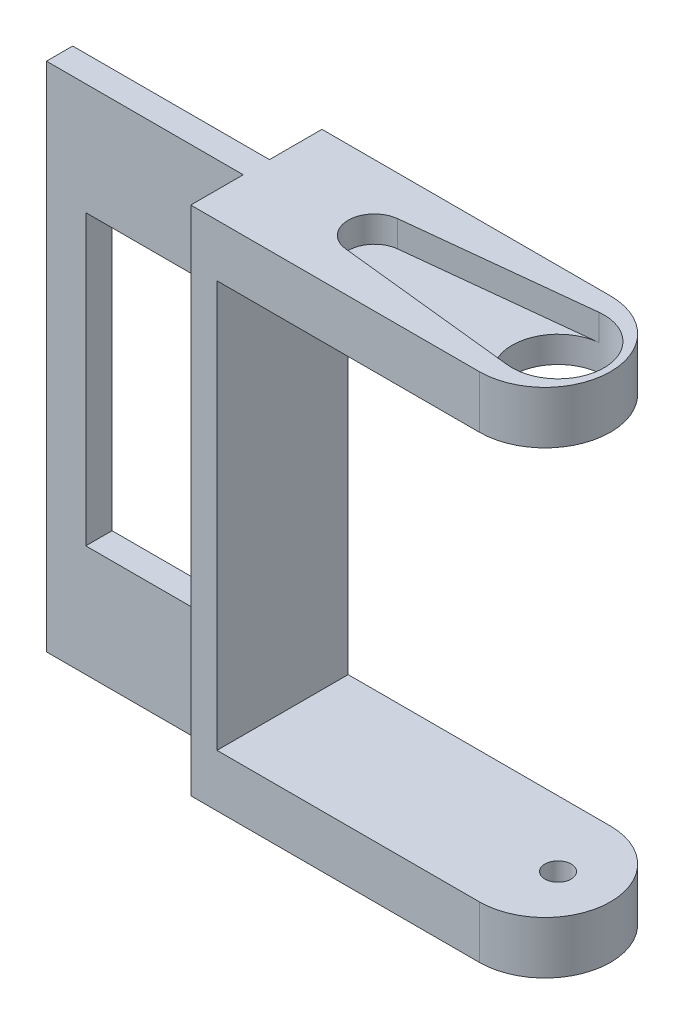
ISO-10303-21;
HEADER;
FILE_DESCRIPTION(('STEP AP214'),'2;1');
FILE_NAME('part.step','',(''),(''),'','','');
FILE_SCHEMA(('AUTOMOTIVE_DESIGN { 1 0 10303 214 1 1 1 1 }'));
ENDSEC;
DATA;
#1=APPLICATION_CONTEXT('core data for automotive mechanical design processes');
#2=APPLICATION_PROTOCOL_DEFINITION('international standard','automotive_design',2000,#1);
#3=PRODUCT_CONTEXT('',#1,'mechanical');
#4=PRODUCT('Part','Part','',(#3));
#5=PRODUCT_RELATED_PRODUCT_CATEGORY('part','',(#4));
#6=PRODUCT_DEFINITION_FORMATION('','',#4);
#7=PRODUCT_DEFINITION_CONTEXT('part definition',#1,'design');
#8=PRODUCT_DEFINITION('design','',#6,#7);
#9=PRODUCT_DEFINITION_SHAPE('','',#8);
#10=(LENGTH_UNIT() NAMED_UNIT(*) SI_UNIT(.MILLI.,.METRE.));
#11=(NAMED_UNIT(*) PLANE_ANGLE_UNIT() SI_UNIT($,.RADIAN.));
#12=(NAMED_UNIT(*) SI_UNIT($,.STERADIAN.) SOLID_ANGLE_UNIT());
#13=UNCERTAINTY_MEASURE_WITH_UNIT(LENGTH_MEASURE(1.E-05),#10,'distance_accuracy_value','');
#14=(GEOMETRIC_REPRESENTATION_CONTEXT(3) GLOBAL_UNCERTAINTY_ASSIGNED_CONTEXT((#13)) GLOBAL_UNIT_ASSIGNED_CONTEXT((#10,
#11,#12)) REPRESENTATION_CONTEXT('',''));
#15=CARTESIAN_POINT('',(0.,0.,0.));
#16=DIRECTION('',(0.,0.,1.));
#17=DIRECTION('',(1.,0.,0.));
#18=AXIS2_PLACEMENT_3D('',#15,#16,#17);
#19=CARTESIAN_POINT('',(-5.,-21.6563307313725,5.));
#20=DIRECTION('',(0.,1.,0.));
#21=DIRECTION('',(-1.,0.,0.));
#22=AXIS2_PLACEMENT_3D('',#19,#20,#21);
#23=CYLINDRICAL_SURFACE('',#22,5.);
#24=DIRECTION('',(0.,1.,0.));
#25=VECTOR('',#24,1.);
#26=CARTESIAN_POINT('',(-5.,0.,10.));
#27=LINE('',#26,#25);
#28=CARTESIAN_POINT('',(-5.,-21.6563307313725,10.));
#29=VERTEX_POINT('',#28);
#30=CARTESIAN_POINT('',(-5.,-17.6563307313725,10.));
#31=VERTEX_POINT('',#30);
#32=EDGE_CURVE('E262',#29,#31,#27,.T.);
#33=ORIENTED_EDGE('',*,*,#32,.F.);
#34=CARTESIAN_POINT('',(-5.,-21.6563307313725,5.));
#35=DIRECTION('',(0.,1.,0.));
#36=DIRECTION('',(-1.,0.,0.));
#37=AXIS2_PLACEMENT_3D('',#34,#35,#36);
#38=CIRCLE('',#37,5.);
#39=CARTESIAN_POINT('',(-5.,-21.6563307313725,0.));
#40=VERTEX_POINT('',#39);
#41=EDGE_CURVE('E49',#40,#29,#38,.F.);
#42=ORIENTED_EDGE('',*,*,#41,.F.);
#43=DIRECTION('',(0.,-1.,0.));
#44=VECTOR('',#43,1.);
#45=CARTESIAN_POINT('',(-5.,-21.6563307313725,0.));
#46=LINE('',#45,#44);
#47=CARTESIAN_POINT('',(-5.,-17.6563307313725,0.));
#48=VERTEX_POINT('',#47);
#49=EDGE_CURVE('E265',#48,#40,#46,.T.);
#50=ORIENTED_EDGE('',*,*,#49,.F.);
#51=CARTESIAN_POINT('',(-5.,-17.6563307313725,5.));
#52=DIRECTION('',(0.,-1.,0.));
#53=DIRECTION('',(0.,0.,-1.));
#54=AXIS2_PLACEMENT_3D('',#51,#52,#53);
#55=CIRCLE('',#54,5.);
#56=EDGE_CURVE('E11',#31,#48,#55,.F.);
#57=ORIENTED_EDGE('',*,*,#56,.F.);
#58=EDGE_LOOP('',(#33,#42,#50,#57));
#59=FACE_BOUND('',#58,.T.);
#60=ADVANCED_FACE('F41',(#59),#23,.T.);
#61=CARTESIAN_POINT('',(-5.,13.3436692686275,5.));
#62=DIRECTION('',(0.,1.,0.));
#63=DIRECTION('',(-1.,0.,0.));
#64=AXIS2_PLACEMENT_3D('',#61,#62,#63);
#65=CYLINDRICAL_SURFACE('',#64,5.);
#66=DIRECTION('',(0.,1.,0.));
#67=VECTOR('',#66,1.);
#68=CARTESIAN_POINT('',(-5.,0.,10.));
#69=LINE('',#68,#67);
#70=CARTESIAN_POINT('',(-5.,13.3436692686275,10.));
#71=VERTEX_POINT('',#70);
#72=CARTESIAN_POINT('',(-5.,17.3436692686275,10.));
#73=VERTEX_POINT('',#72);
#74=EDGE_CURVE('E252',#71,#73,#69,.T.);
#75=ORIENTED_EDGE('',*,*,#74,.F.);
#76=CARTESIAN_POINT('',(-5.,13.3436692686275,5.));
#77=DIRECTION('',(0.,1.,0.));
#78=DIRECTION('',(-1.,0.,0.));
#79=AXIS2_PLACEMENT_3D('',#76,#77,#78);
#80=CIRCLE('',#79,5.);
#81=CARTESIAN_POINT('',(-5.,13.3436692686275,0.));
#82=VERTEX_POINT('',#81);
#83=EDGE_CURVE('E258',#82,#71,#80,.F.);
#84=ORIENTED_EDGE('',*,*,#83,.F.);
#85=DIRECTION('',(0.,-1.,0.));
#86=VECTOR('',#85,1.);
#87=CARTESIAN_POINT('',(-5.,13.3436692686275,0.));
#88=LINE('',#87,#86);
#89=CARTESIAN_POINT('',(-5.,17.3436692686275,0.));
#90=VERTEX_POINT('',#89);
#91=EDGE_CURVE('E255',#90,#82,#88,.T.);
#92=ORIENTED_EDGE('',*,*,#91,.F.);
#93=CARTESIAN_POINT('',(-5.,17.3436692686275,5.));
#94=DIRECTION('',(0.,-1.,0.));
#95=DIRECTION('',(0.,0.,-1.));
#96=AXIS2_PLACEMENT_3D('',#93,#94,#95);
#97=CIRCLE('',#96,5.);
#98=EDGE_CURVE('E260',#73,#90,#97,.F.);
#99=ORIENTED_EDGE('',*,*,#98,.F.);
#100=EDGE_LOOP('',(#75,#84,#92,#99));
#101=FACE_BOUND('',#100,.T.);
#102=ADVANCED_FACE('F381',(#101),#65,.T.);
#103=CARTESIAN_POINT('',(-27.,-21.6563307313725,10.));
#104=DIRECTION('',(1.,0.,0.));
#105=DIRECTION('',(0.,1.,0.));
#106=AXIS2_PLACEMENT_3D('',#103,#104,#105);
#107=PLANE('',#106);
#108=DIRECTION('',(0.,0.,1.));
#109=VECTOR('',#108,1.);
#110=CARTESIAN_POINT('',(-27.,8.8436692686275,0.999999999999997));
#111=LINE('',#110,#109);
#112=CARTESIAN_POINT('',(-27.,8.8436692686275,4.));
#113=VERTEX_POINT('',#112);
#114=CARTESIAN_POINT('',(-27.,8.8436692686275,6.));
#115=VERTEX_POINT('',#114);
#116=EDGE_CURVE('E186',#113,#115,#111,.T.);
#117=ORIENTED_EDGE('',*,*,#116,.F.);
#118=DIRECTION('',(0.,1.,0.));
#119=VECTOR('',#118,1.);
#120=CARTESIAN_POINT('',(-27.,-21.6563307313725,4.));
#121=LINE('',#120,#119);
#122=CARTESIAN_POINT('',(-27.,17.3436692686275,4.));
#123=VERTEX_POINT('',#122);
#124=EDGE_CURVE('E199',#113,#123,#121,.T.);
#125=ORIENTED_EDGE('',*,*,#124,.T.);
#126=DIRECTION('',(0.,0.,-1.));
#127=VECTOR('',#126,1.);
#128=CARTESIAN_POINT('',(-27.,17.3436692686275,10.));
#129=LINE('',#128,#127);
#130=CARTESIAN_POINT('',(-27.,17.3436692686275,0.));
#131=VERTEX_POINT('',#130);
#132=EDGE_CURVE('E225',#123,#131,#129,.T.);
#133=ORIENTED_EDGE('',*,*,#132,.T.);
#134=DIRECTION('',(0.,-1.,0.));
#135=VECTOR('',#134,1.);
#136=CARTESIAN_POINT('',(-27.,-21.6563307313725,0.));
#137=LINE('',#136,#135);
#138=CARTESIAN_POINT('',(-27.,-21.6563307313725,0.));
#139=VERTEX_POINT('',#138);
#140=EDGE_CURVE('E226',#131,#139,#137,.T.);
#141=ORIENTED_EDGE('',*,*,#140,.T.);
#142=DIRECTION('',(0.,0.,-1.));
#143=VECTOR('',#142,1.);
#144=CARTESIAN_POINT('',(-27.,-21.6563307313725,10.));
#145=LINE('',#144,#143);
#146=CARTESIAN_POINT('',(-27.,-21.6563307313725,4.));
#147=VERTEX_POINT('',#146);
#148=EDGE_CURVE('E249',#147,#139,#145,.T.);
#149=ORIENTED_EDGE('',*,*,#148,.F.);
#150=CARTESIAN_POINT('',(-27.,-13.1563307313725,4.));
#151=VERTEX_POINT('',#150);
#152=EDGE_CURVE('E185',#147,#151,#121,.T.);
#153=ORIENTED_EDGE('',*,*,#152,.T.);
#154=DIRECTION('',(0.,0.,1.));
#155=VECTOR('',#154,1.);
#156=CARTESIAN_POINT('',(-27.,-13.1563307313725,0.999999999999997));
#157=LINE('',#156,#155);
#158=CARTESIAN_POINT('',(-27.,-13.1563307313725,6.));
#159=VERTEX_POINT('',#158);
#160=EDGE_CURVE('E56',#151,#159,#157,.T.);
#161=ORIENTED_EDGE('',*,*,#160,.T.);
#162=DIRECTION('',(0.,1.,0.));
#163=VECTOR('',#162,1.);
#164=CARTESIAN_POINT('',(-27.,-21.6563307313725,6.));
#165=LINE('',#164,#163);
#166=CARTESIAN_POINT('',(-27.,-21.6563307313725,6.));
#167=VERTEX_POINT('',#166);
#168=EDGE_CURVE('E182',#167,#159,#165,.T.);
#169=ORIENTED_EDGE('',*,*,#168,.F.);
#170=CARTESIAN_POINT('',(-27.,-21.6563307313725,10.));
#171=VERTEX_POINT('',#170);
#172=EDGE_CURVE('E250',#171,#167,#145,.T.);
#173=ORIENTED_EDGE('',*,*,#172,.F.);
#174=DIRECTION('',(0.,-1.,0.));
#175=VECTOR('',#174,1.);
#176=CARTESIAN_POINT('',(-27.,-21.6563307313725,10.));
#177=LINE('',#176,#175);
#178=CARTESIAN_POINT('',(-27.,17.3436692686275,10.));
#179=VERTEX_POINT('',#178);
#180=EDGE_CURVE('E209',#179,#171,#177,.T.);
#181=ORIENTED_EDGE('',*,*,#180,.F.);
#182=CARTESIAN_POINT('',(-27.,17.3436692686275,6.));
#183=VERTEX_POINT('',#182);
#184=EDGE_CURVE('E240',#179,#183,#129,.T.);
#185=ORIENTED_EDGE('',*,*,#184,.T.);
#186=EDGE_CURVE('E200',#115,#183,#165,.T.);
#187=ORIENTED_EDGE('',*,*,#186,.F.);
#188=EDGE_LOOP('',(#117,#125,#133,#141,#149,#153,#161,#169,#173,#181,#185,#187));
#189=FACE_BOUND('',#188,.T.);
#190=ADVANCED_FACE('F179',(#189),#107,.F.);
#191=CARTESIAN_POINT('',(0.,-21.6563307313725,10.));
#192=DIRECTION('',(0.,1.,0.));
#193=DIRECTION('',(-1.,0.,0.));
#194=AXIS2_PLACEMENT_3D('',#191,#192,#193);
#195=PLANE('',#194);
#196=CARTESIAN_POINT('',(-4.,-21.6563307313725,5.));
#197=DIRECTION('',(0.,1.,0.));
#198=DIRECTION('',(-1.,0.,0.));
#199=AXIS2_PLACEMENT_3D('',#196,#197,#198);
#200=CIRCLE('',#199,1.);
#201=CARTESIAN_POINT('',(-5.,-21.6563307313725,5.));
#202=VERTEX_POINT('',#201);
#203=EDGE_CURVE('E299',#202,#202,#200,.T.);
#204=ORIENTED_EDGE('',*,*,#203,.T.);
#205=EDGE_LOOP('',(#204));
#206=FACE_BOUND('',#205,.T.);
#207=DIRECTION('',(1.,0.,0.));
#208=VECTOR('',#207,1.);
#209=CARTESIAN_POINT('',(0.,-21.6563307313725,0.));
#210=LINE('',#209,#208);
#211=EDGE_CURVE('E229',#139,#40,#210,.T.);
#212=ORIENTED_EDGE('',*,*,#211,.T.);
#213=ORIENTED_EDGE('',*,*,#41,.T.);
#214=DIRECTION('',(1.,0.,0.));
#215=VECTOR('',#214,1.);
#216=CARTESIAN_POINT('',(0.,-21.6563307313725,10.));
#217=LINE('',#216,#215);
#218=EDGE_CURVE('E212',#171,#29,#217,.T.);
#219=ORIENTED_EDGE('',*,*,#218,.F.);
#220=ORIENTED_EDGE('',*,*,#172,.T.);
#221=DIRECTION('',(1.,0.,0.));
#222=VECTOR('',#221,1.);
#223=CARTESIAN_POINT('',(-27.,-21.6563307313725,6.));
#224=LINE('',#223,#222);
#225=CARTESIAN_POINT('',(-42.,-21.6563307313725,6.));
#226=VERTEX_POINT('',#225);
#227=EDGE_CURVE('E198',#226,#167,#224,.T.);
#228=ORIENTED_EDGE('',*,*,#227,.F.);
#229=DIRECTION('',(0.,0.,1.));
#230=VECTOR('',#229,1.);
#231=CARTESIAN_POINT('',(-42.,-21.6563307313725,4.));
#232=LINE('',#231,#230);
#233=CARTESIAN_POINT('',(-42.,-21.6563307313725,4.));
#234=VERTEX_POINT('',#233);
#235=EDGE_CURVE('E282',#234,#226,#232,.T.);
#236=ORIENTED_EDGE('',*,*,#235,.F.);
#237=DIRECTION('',(-1.,0.,0.));
#238=VECTOR('',#237,1.);
#239=CARTESIAN_POINT('',(-27.,-21.6563307313725,4.));
#240=LINE('',#239,#238);
#241=EDGE_CURVE('E289',#147,#234,#240,.T.);
#242=ORIENTED_EDGE('',*,*,#241,.F.);
#243=ORIENTED_EDGE('',*,*,#148,.T.);
#244=EDGE_LOOP('',(#212,#213,#219,#220,#228,#236,#242,#243));
#245=FACE_BOUND('',#244,.T.);
#246=ADVANCED_FACE('F269',(#206,#245),#195,.F.);
#247=CARTESIAN_POINT('',(-25.,-17.6563307313725,10.));
#248=DIRECTION('',(0.,-1.,0.));
#249=DIRECTION('',(0.,0.,-1.));
#250=AXIS2_PLACEMENT_3D('',#247,#248,#249);
#251=PLANE('',#250);
#252=CARTESIAN_POINT('',(-4.,-17.6563307313725,5.));
#253=DIRECTION('',(0.,-1.,0.));
#254=DIRECTION('',(0.,0.,-1.));
#255=AXIS2_PLACEMENT_3D('',#252,#253,#254);
#256=CIRCLE('',#255,1.);
#257=CARTESIAN_POINT('',(-4.,-17.6563307313725,4.));
#258=VERTEX_POINT('',#257);
#259=EDGE_CURVE('E350',#258,#258,#256,.T.);
#260=ORIENTED_EDGE('',*,*,#259,.T.);
#261=EDGE_LOOP('',(#260));
#262=FACE_BOUND('',#261,.T.);
#263=DIRECTION('',(-1.,0.,0.));
#264=VECTOR('',#263,1.);
#265=CARTESIAN_POINT('',(-25.,-17.6563307313725,10.));
#266=LINE('',#265,#264);
#267=CARTESIAN_POINT('',(-25.,-17.6563307313725,10.));
#268=VERTEX_POINT('',#267);
#269=EDGE_CURVE('E216',#31,#268,#266,.T.);
#270=ORIENTED_EDGE('',*,*,#269,.F.);
#271=ORIENTED_EDGE('',*,*,#56,.T.);
#272=DIRECTION('',(-1.,0.,0.));
#273=VECTOR('',#272,1.);
#274=CARTESIAN_POINT('',(-25.,-17.6563307313725,0.));
#275=LINE('',#274,#273);
#276=CARTESIAN_POINT('',(-25.,-17.6563307313725,0.));
#277=VERTEX_POINT('',#276);
#278=EDGE_CURVE('E232',#48,#277,#275,.T.);
#279=ORIENTED_EDGE('',*,*,#278,.T.);
#280=DIRECTION('',(0.,0.,-1.));
#281=VECTOR('',#280,1.);
#282=CARTESIAN_POINT('',(-25.,-17.6563307313725,10.));
#283=LINE('',#282,#281);
#284=EDGE_CURVE('E246',#268,#277,#283,.T.);
#285=ORIENTED_EDGE('',*,*,#284,.F.);
#286=EDGE_LOOP('',(#270,#271,#279,#285));
#287=FACE_BOUND('',#286,.T.);
#288=ADVANCED_FACE('F398',(#262,#287),#251,.F.);
#289=CARTESIAN_POINT('',(-25.,13.3436692686275,10.));
#290=DIRECTION('',(-1.,0.,0.));
#291=DIRECTION('',(0.,-1.,0.));
#292=AXIS2_PLACEMENT_3D('',#289,#290,#291);
#293=PLANE('',#292);
#294=DIRECTION('',(0.,1.,0.));
#295=VECTOR('',#294,1.);
#296=CARTESIAN_POINT('',(-25.,13.3436692686275,0.));
#297=LINE('',#296,#295);
#298=CARTESIAN_POINT('',(-25.,13.3436692686275,0.));
#299=VERTEX_POINT('',#298);
#300=EDGE_CURVE('E234',#277,#299,#297,.T.);
#301=ORIENTED_EDGE('',*,*,#300,.T.);
#302=DIRECTION('',(0.,0.,-1.));
#303=VECTOR('',#302,1.);
#304=CARTESIAN_POINT('',(-25.,13.3436692686275,10.));
#305=LINE('',#304,#303);
#306=CARTESIAN_POINT('',(-25.,13.3436692686275,10.));
#307=VERTEX_POINT('',#306);
#308=EDGE_CURVE('E243',#307,#299,#305,.T.);
#309=ORIENTED_EDGE('',*,*,#308,.F.);
#310=DIRECTION('',(0.,1.,0.));
#311=VECTOR('',#310,1.);
#312=CARTESIAN_POINT('',(-25.,13.3436692686275,10.));
#313=LINE('',#312,#311);
#314=EDGE_CURVE('E218',#268,#307,#313,.T.);
#315=ORIENTED_EDGE('',*,*,#314,.F.);
#316=ORIENTED_EDGE('',*,*,#284,.T.);
#317=EDGE_LOOP('',(#301,#309,#315,#316));
#318=FACE_BOUND('',#317,.T.);
#319=ADVANCED_FACE('F400',(#318),#293,.F.);
#320=CARTESIAN_POINT('',(0.,13.3436692686275,10.));
#321=DIRECTION('',(0.,1.,0.));
#322=DIRECTION('',(-1.,0.,0.));
#323=AXIS2_PLACEMENT_3D('',#320,#321,#322);
#324=PLANE('',#323);
#325=CARTESIAN_POINT('',(-4.,13.3436692686275,5.));
#326=DIRECTION('',(0.,1.,0.));
#327=DIRECTION('',(-1.,0.,0.));
#328=AXIS2_PLACEMENT_3D('',#325,#326,#327);
#329=CIRCLE('',#328,3.49999999999999);
#330=CARTESIAN_POINT('',(-7.49999999999999,13.3436692686275,5.));
#331=VERTEX_POINT('',#330);
#332=EDGE_CURVE('E324',#331,#331,#329,.T.);
#333=ORIENTED_EDGE('',*,*,#332,.T.);
#334=EDGE_LOOP('',(#333));
#335=FACE_BOUND('',#334,.T.);
#336=DIRECTION('',(1.,0.,0.));
#337=VECTOR('',#336,1.);
#338=CARTESIAN_POINT('',(0.,13.3436692686275,0.));
#339=LINE('',#338,#337);
#340=EDGE_CURVE('E236',#299,#82,#339,.T.);
#341=ORIENTED_EDGE('',*,*,#340,.T.);
#342=ORIENTED_EDGE('',*,*,#83,.T.);
#343=DIRECTION('',(1.,0.,0.));
#344=VECTOR('',#343,1.);
#345=CARTESIAN_POINT('',(0.,13.3436692686275,10.));
#346=LINE('',#345,#344);
#347=EDGE_CURVE('E220',#307,#71,#346,.T.);
#348=ORIENTED_EDGE('',*,*,#347,.F.);
#349=ORIENTED_EDGE('',*,*,#308,.T.);
#350=EDGE_LOOP('',(#341,#342,#348,#349));
#351=FACE_BOUND('',#350,.T.);
#352=ADVANCED_FACE('F404',(#335,#351),#324,.F.);
#353=CARTESIAN_POINT('',(-27.,17.3436692686275,10.));
#354=DIRECTION('',(0.,-1.,0.));
#355=DIRECTION('',(0.,0.,-1.));
#356=AXIS2_PLACEMENT_3D('',#353,#354,#355);
#357=PLANE('',#356);
#358=DIRECTION('',(0.994243636219647,0.,0.107142857142857));
#359=VECTOR('',#358,1.);
#360=CARTESIAN_POINT('',(-18.2142857142857,17.3436692686275,6.98848727243929));
#361=LINE('',#360,#359);
#362=CARTESIAN_POINT('',(-18.2142857142857,17.3436692686275,6.98848727243929));
#363=VERTEX_POINT('',#362);
#364=CARTESIAN_POINT('',(-4.375,17.3436692686275,8.47985272676876));
#365=VERTEX_POINT('',#364);
#366=EDGE_CURVE('E340',#363,#365,#361,.T.);
#367=ORIENTED_EDGE('',*,*,#366,.F.);
#368=CARTESIAN_POINT('',(-18.,17.3436692686275,5.));
#369=DIRECTION('',(0.,1.,0.));
#370=DIRECTION('',(0.,0.,1.));
#371=AXIS2_PLACEMENT_3D('',#368,#369,#370);
#372=CIRCLE('',#371,2.);
#373=CARTESIAN_POINT('',(-18.2142857142857,17.3436692686275,3.0115127275607));
#374=VERTEX_POINT('',#373);
#375=EDGE_CURVE('E327',#374,#363,#372,.T.);
#376=ORIENTED_EDGE('',*,*,#375,.F.);
#377=DIRECTION('',(-0.994243636219647,0.,0.107142857142857));
#378=VECTOR('',#377,1.);
#379=CARTESIAN_POINT('',(-18.2142857142857,17.3436692686275,3.0115127275607));
#380=LINE('',#379,#378);
#381=CARTESIAN_POINT('',(-4.375,17.3436692686275,1.52014727323123));
#382=VERTEX_POINT('',#381);
#383=EDGE_CURVE('E332',#382,#374,#380,.T.);
#384=ORIENTED_EDGE('',*,*,#383,.F.);
#385=CARTESIAN_POINT('',(-4.,17.3436692686275,4.99999999999999));
#386=DIRECTION('',(0.,1.,0.));
#387=DIRECTION('',(0.,0.,-1.));
#388=AXIS2_PLACEMENT_3D('',#385,#386,#387);
#389=CIRCLE('',#388,3.5);
#390=EDGE_CURVE('E343',#365,#382,#389,.T.);
#391=ORIENTED_EDGE('',*,*,#390,.F.);
#392=EDGE_LOOP('',(#367,#376,#384,#391));
#393=FACE_BOUND('',#392,.T.);
#394=DIRECTION('',(-1.,0.,0.));
#395=VECTOR('',#394,1.);
#396=CARTESIAN_POINT('',(-27.,17.3436692686275,10.));
#397=LINE('',#396,#395);
#398=EDGE_CURVE('E223',#73,#179,#397,.T.);
#399=ORIENTED_EDGE('',*,*,#398,.F.);
#400=ORIENTED_EDGE('',*,*,#98,.T.);
#401=DIRECTION('',(-1.,0.,0.));
#402=VECTOR('',#401,1.);
#403=CARTESIAN_POINT('',(-27.,17.3436692686275,0.));
#404=LINE('',#403,#402);
#405=EDGE_CURVE('E213',#90,#131,#404,.T.);
#406=ORIENTED_EDGE('',*,*,#405,.T.);
#407=ORIENTED_EDGE('',*,*,#132,.F.);
#408=DIRECTION('',(-1.,0.,0.));
#409=VECTOR('',#408,1.);
#410=CARTESIAN_POINT('',(-27.,17.3436692686275,4.));
#411=LINE('',#410,#409);
#412=CARTESIAN_POINT('',(-42.,17.3436692686275,4.));
#413=VERTEX_POINT('',#412);
#414=EDGE_CURVE('E295',#123,#413,#411,.T.);
#415=ORIENTED_EDGE('',*,*,#414,.T.);
#416=DIRECTION('',(0.,0.,1.));
#417=VECTOR('',#416,1.);
#418=CARTESIAN_POINT('',(-42.,17.3436692686275,4.));
#419=LINE('',#418,#417);
#420=CARTESIAN_POINT('',(-42.,17.3436692686275,6.));
#421=VERTEX_POINT('',#420);
#422=EDGE_CURVE('E298',#413,#421,#419,.T.);
#423=ORIENTED_EDGE('',*,*,#422,.T.);
#424=DIRECTION('',(1.,0.,0.));
#425=VECTOR('',#424,1.);
#426=CARTESIAN_POINT('',(-27.,17.3436692686275,6.));
#427=LINE('',#426,#425);
#428=EDGE_CURVE('E291',#421,#183,#427,.T.);
#429=ORIENTED_EDGE('',*,*,#428,.T.);
#430=ORIENTED_EDGE('',*,*,#184,.F.);
#431=EDGE_LOOP('',(#399,#400,#406,#407,#415,#423,#429,#430));
#432=FACE_BOUND('',#431,.T.);
#433=ADVANCED_FACE('F303',(#393,#432),#357,.F.);
#434=CARTESIAN_POINT('',(0.,0.,10.));
#435=DIRECTION('',(0.,0.,-1.));
#436=DIRECTION('',(-1.,0.,0.));
#437=AXIS2_PLACEMENT_3D('',#434,#435,#436);
#438=PLANE('',#437);
#439=ORIENTED_EDGE('',*,*,#218,.T.);
#440=ORIENTED_EDGE('',*,*,#32,.T.);
#441=ORIENTED_EDGE('',*,*,#269,.T.);
#442=ORIENTED_EDGE('',*,*,#314,.T.);
#443=ORIENTED_EDGE('',*,*,#347,.T.);
#444=ORIENTED_EDGE('',*,*,#74,.T.);
#445=ORIENTED_EDGE('',*,*,#398,.T.);
#446=ORIENTED_EDGE('',*,*,#180,.T.);
#447=EDGE_LOOP('',(#439,#440,#441,#442,#443,#444,#445,#446));
#448=FACE_BOUND('',#447,.T.);
#449=ADVANCED_FACE('F275',(#448),#438,.F.);
#450=CARTESIAN_POINT('',(0.,0.,0.));
#451=DIRECTION('',(0.,0.,-1.));
#452=DIRECTION('',(-1.,0.,0.));
#453=AXIS2_PLACEMENT_3D('',#450,#451,#452);
#454=PLANE('',#453);
#455=ORIENTED_EDGE('',*,*,#278,.F.);
#456=ORIENTED_EDGE('',*,*,#49,.T.);
#457=ORIENTED_EDGE('',*,*,#211,.F.);
#458=ORIENTED_EDGE('',*,*,#140,.F.);
#459=ORIENTED_EDGE('',*,*,#405,.F.);
#460=ORIENTED_EDGE('',*,*,#91,.T.);
#461=ORIENTED_EDGE('',*,*,#340,.F.);
#462=ORIENTED_EDGE('',*,*,#300,.F.);
#463=EDGE_LOOP('',(#455,#456,#457,#458,#459,#460,#461,#462));
#464=FACE_BOUND('',#463,.T.);
#465=ADVANCED_FACE('F411',(#464),#454,.T.);
#466=CARTESIAN_POINT('',(-27.,-21.6563307313725,4.));
#467=DIRECTION('',(0.,0.,-1.));
#468=DIRECTION('',(-1.,0.,0.));
#469=AXIS2_PLACEMENT_3D('',#466,#467,#468);
#470=PLANE('',#469);
#471=DIRECTION('',(1.,0.,0.));
#472=VECTOR('',#471,1.);
#473=CARTESIAN_POINT('',(-27.,8.8436692686275,4.));
#474=LINE('',#473,#472);
#475=CARTESIAN_POINT('',(-39.,8.8436692686275,4.));
#476=VERTEX_POINT('',#475);
#477=EDGE_CURVE('E318',#476,#113,#474,.T.);
#478=ORIENTED_EDGE('',*,*,#477,.F.);
#479=DIRECTION('',(0.,1.,0.));
#480=VECTOR('',#479,1.);
#481=CARTESIAN_POINT('',(-39.,-21.6563307313725,4.));
#482=LINE('',#481,#480);
#483=CARTESIAN_POINT('',(-39.,-13.1563307313725,4.));
#484=VERTEX_POINT('',#483);
#485=EDGE_CURVE('E320',#484,#476,#482,.T.);
#486=ORIENTED_EDGE('',*,*,#485,.F.);
#487=DIRECTION('',(-1.,0.,0.));
#488=VECTOR('',#487,1.);
#489=CARTESIAN_POINT('',(-27.,-13.1563307313725,4.));
#490=LINE('',#489,#488);
#491=EDGE_CURVE('E315',#151,#484,#490,.T.);
#492=ORIENTED_EDGE('',*,*,#491,.F.);
#493=ORIENTED_EDGE('',*,*,#152,.F.);
#494=ORIENTED_EDGE('',*,*,#241,.T.);
#495=DIRECTION('',(0.,1.,0.));
#496=VECTOR('',#495,1.);
#497=CARTESIAN_POINT('',(-42.,-21.6563307313725,4.));
#498=LINE('',#497,#496);
#499=EDGE_CURVE('E207',#234,#413,#498,.T.);
#500=ORIENTED_EDGE('',*,*,#499,.T.);
#501=ORIENTED_EDGE('',*,*,#414,.F.);
#502=ORIENTED_EDGE('',*,*,#124,.F.);
#503=EDGE_LOOP('',(#478,#486,#492,#493,#494,#500,#501,#502));
#504=FACE_BOUND('',#503,.T.);
#505=ADVANCED_FACE('F414',(#504),#470,.T.);
#506=CARTESIAN_POINT('',(-27.,-21.6563307313725,6.));
#507=DIRECTION('',(0.,0.,1.));
#508=DIRECTION('',(1.,0.,0.));
#509=AXIS2_PLACEMENT_3D('',#506,#507,#508);
#510=PLANE('',#509);
#511=DIRECTION('',(-1.,0.,0.));
#512=VECTOR('',#511,1.);
#513=CARTESIAN_POINT('',(-27.,8.8436692686275,6.));
#514=LINE('',#513,#512);
#515=CARTESIAN_POINT('',(-39.,8.8436692686275,6.));
#516=VERTEX_POINT('',#515);
#517=EDGE_CURVE('E193',#115,#516,#514,.T.);
#518=ORIENTED_EDGE('',*,*,#517,.F.);
#519=ORIENTED_EDGE('',*,*,#186,.T.);
#520=ORIENTED_EDGE('',*,*,#428,.F.);
#521=DIRECTION('',(0.,1.,0.));
#522=VECTOR('',#521,1.);
#523=CARTESIAN_POINT('',(-42.,-21.6563307313725,6.));
#524=LINE('',#523,#522);
#525=EDGE_CURVE('E203',#226,#421,#524,.T.);
#526=ORIENTED_EDGE('',*,*,#525,.F.);
#527=ORIENTED_EDGE('',*,*,#227,.T.);
#528=ORIENTED_EDGE('',*,*,#168,.T.);
#529=DIRECTION('',(1.,0.,0.));
#530=VECTOR('',#529,1.);
#531=CARTESIAN_POINT('',(-27.,-13.1563307313725,6.));
#532=LINE('',#531,#530);
#533=CARTESIAN_POINT('',(-39.,-13.1563307313725,6.));
#534=VERTEX_POINT('',#533);
#535=EDGE_CURVE('E190',#534,#159,#532,.T.);
#536=ORIENTED_EDGE('',*,*,#535,.F.);
#537=DIRECTION('',(0.,-1.,0.));
#538=VECTOR('',#537,1.);
#539=CARTESIAN_POINT('',(-39.,8.8436692686275,6.));
#540=LINE('',#539,#538);
#541=EDGE_CURVE('E64',#516,#534,#540,.T.);
#542=ORIENTED_EDGE('',*,*,#541,.F.);
#543=EDGE_LOOP('',(#518,#519,#520,#526,#527,#528,#536,#542));
#544=FACE_BOUND('',#543,.T.);
#545=ADVANCED_FACE('F196',(#544),#510,.T.);
#546=CARTESIAN_POINT('',(-42.,-21.6563307313725,4.));
#547=DIRECTION('',(-1.,0.,0.));
#548=DIRECTION('',(0.,0.,1.));
#549=AXIS2_PLACEMENT_3D('',#546,#547,#548);
#550=PLANE('',#549);
#551=ORIENTED_EDGE('',*,*,#422,.F.);
#552=ORIENTED_EDGE('',*,*,#499,.F.);
#553=ORIENTED_EDGE('',*,*,#235,.T.);
#554=ORIENTED_EDGE('',*,*,#525,.T.);
#555=EDGE_LOOP('',(#551,#552,#553,#554));
#556=FACE_BOUND('',#555,.T.);
#557=ADVANCED_FACE('F287',(#556),#550,.T.);
#558=CARTESIAN_POINT('',(-4.,-25.6563307313725,5.));
#559=DIRECTION('',(0.,1.,0.));
#560=DIRECTION('',(0.,0.,1.));
#561=AXIS2_PLACEMENT_3D('',#558,#559,#560);
#562=CYLINDRICAL_SURFACE('',#561,1.);
#563=ORIENTED_EDGE('',*,*,#259,.F.);
#564=EDGE_LOOP('',(#563));
#565=FACE_BOUND('',#564,.T.);
#566=ORIENTED_EDGE('',*,*,#203,.F.);
#567=EDGE_LOOP('',(#566));
#568=FACE_BOUND('',#567,.T.);
#569=ADVANCED_FACE('F362',(#565,#568),#562,.F.);
#570=CARTESIAN_POINT('',(-18.,15.3436692686275,5.));
#571=DIRECTION('',(0.,1.,0.));
#572=DIRECTION('',(0.,0.,1.));
#573=AXIS2_PLACEMENT_3D('',#570,#571,#572);
#574=PLANE('',#573);
#575=CARTESIAN_POINT('',(-4.,15.3436692686275,5.));
#576=DIRECTION('',(0.,1.,0.));
#577=DIRECTION('',(0.,0.,1.));
#578=AXIS2_PLACEMENT_3D('',#575,#576,#577);
#579=CIRCLE('',#578,3.49999999999999);
#580=CARTESIAN_POINT('',(-4.375,15.3436692686275,1.52014727323124));
#581=VERTEX_POINT('',#580);
#582=CARTESIAN_POINT('',(-4.375,15.3436692686275,8.47985272676876));
#583=VERTEX_POINT('',#582);
#584=EDGE_CURVE('E322',#581,#583,#579,.T.);
#585=ORIENTED_EDGE('',*,*,#584,.F.);
#586=DIRECTION('',(-0.994243636219647,0.,0.107142857142857));
#587=VECTOR('',#586,1.);
#588=CARTESIAN_POINT('',(-18.2142857142857,15.3436692686275,3.0115127275607));
#589=LINE('',#588,#587);
#590=CARTESIAN_POINT('',(-18.2142857142857,15.3436692686275,3.0115127275607));
#591=VERTEX_POINT('',#590);
#592=EDGE_CURVE('E335',#581,#591,#589,.T.);
#593=ORIENTED_EDGE('',*,*,#592,.T.);
#594=CARTESIAN_POINT('',(-18.,15.3436692686275,5.));
#595=DIRECTION('',(0.,1.,0.));
#596=DIRECTION('',(0.,0.,1.));
#597=AXIS2_PLACEMENT_3D('',#594,#595,#596);
#598=CIRCLE('',#597,2.);
#599=CARTESIAN_POINT('',(-18.2142857142857,15.3436692686275,6.98848727243929));
#600=VERTEX_POINT('',#599);
#601=EDGE_CURVE('E328',#591,#600,#598,.T.);
#602=ORIENTED_EDGE('',*,*,#601,.T.);
#603=DIRECTION('',(0.994243636219647,0.,0.107142857142857));
#604=VECTOR('',#603,1.);
#605=CARTESIAN_POINT('',(-18.2142857142857,15.3436692686275,6.98848727243929));
#606=LINE('',#605,#604);
#607=EDGE_CURVE('E331',#600,#583,#606,.T.);
#608=ORIENTED_EDGE('',*,*,#607,.T.);
#609=EDGE_LOOP('',(#585,#593,#602,#608));
#610=FACE_BOUND('',#609,.T.);
#611=ADVANCED_FACE('F364',(#610),#574,.T.);
#612=CARTESIAN_POINT('',(-18.,15.3436692686275,5.));
#613=DIRECTION('',(0.,1.,0.));
#614=DIRECTION('',(0.,0.,1.));
#615=AXIS2_PLACEMENT_3D('',#612,#613,#614);
#616=CYLINDRICAL_SURFACE('',#615,2.);
#617=ORIENTED_EDGE('',*,*,#375,.T.);
#618=DIRECTION('',(0.,1.,0.));
#619=VECTOR('',#618,1.);
#620=CARTESIAN_POINT('',(-18.2142857142857,15.3436692686275,6.98848727243929));
#621=LINE('',#620,#619);
#622=EDGE_CURVE('E338',#600,#363,#621,.T.);
#623=ORIENTED_EDGE('',*,*,#622,.F.);
#624=ORIENTED_EDGE('',*,*,#601,.F.);
#625=DIRECTION('',(0.,1.,0.));
#626=VECTOR('',#625,1.);
#627=CARTESIAN_POINT('',(-18.2142857142857,15.3436692686275,3.0115127275607));
#628=LINE('',#627,#626);
#629=EDGE_CURVE('E348',#591,#374,#628,.T.);
#630=ORIENTED_EDGE('',*,*,#629,.T.);
#631=EDGE_LOOP('',(#617,#623,#624,#630));
#632=FACE_BOUND('',#631,.T.);
#633=ADVANCED_FACE('F372',(#632),#616,.F.);
#634=CARTESIAN_POINT('',(-18.2142857142857,15.3436692686275,3.0115127275607));
#635=DIRECTION('',(-0.107142857142857,0.,-0.994243636219647));
#636=DIRECTION('',(-0.994243636219647,0.,0.107142857142857));
#637=AXIS2_PLACEMENT_3D('',#634,#635,#636);
#638=PLANE('',#637);
#639=ORIENTED_EDGE('',*,*,#383,.T.);
#640=ORIENTED_EDGE('',*,*,#629,.F.);
#641=ORIENTED_EDGE('',*,*,#592,.F.);
#642=DIRECTION('',(0.,1.,0.));
#643=VECTOR('',#642,1.);
#644=CARTESIAN_POINT('',(-4.375,15.3436692686275,1.52014727323123));
#645=LINE('',#644,#643);
#646=EDGE_CURVE('E351',#581,#382,#645,.T.);
#647=ORIENTED_EDGE('',*,*,#646,.T.);
#648=EDGE_LOOP('',(#639,#640,#641,#647));
#649=FACE_BOUND('',#648,.T.);
#650=ADVANCED_FACE('F471',(#649),#638,.F.);
#651=CARTESIAN_POINT('',(-4.,15.3436692686275,4.99999999999999));
#652=DIRECTION('',(0.,1.,0.));
#653=DIRECTION('',(0.,0.,1.));
#654=AXIS2_PLACEMENT_3D('',#651,#652,#653);
#655=CYLINDRICAL_SURFACE('',#654,3.5);
#656=ORIENTED_EDGE('',*,*,#390,.T.);
#657=ORIENTED_EDGE('',*,*,#646,.F.);
#658=ORIENTED_EDGE('',*,*,#584,.T.);
#659=DIRECTION('',(0.,1.,0.));
#660=VECTOR('',#659,1.);
#661=CARTESIAN_POINT('',(-4.375,15.3436692686275,8.47985272676876));
#662=LINE('',#661,#660);
#663=EDGE_CURVE('E353',#583,#365,#662,.T.);
#664=ORIENTED_EDGE('',*,*,#663,.T.);
#665=EDGE_LOOP('',(#656,#657,#658,#664));
#666=FACE_BOUND('',#665,.T.);
#667=ORIENTED_EDGE('',*,*,#332,.F.);
#668=EDGE_LOOP('',(#667));
#669=FACE_BOUND('',#668,.T.);
#670=ADVANCED_FACE('F461',(#666,#669),#655,.F.);
#671=CARTESIAN_POINT('',(-18.2142857142857,15.3436692686275,6.98848727243929));
#672=DIRECTION('',(-0.107142857142857,0.,0.994243636219647));
#673=DIRECTION('',(0.994243636219647,0.,0.107142857142857));
#674=AXIS2_PLACEMENT_3D('',#671,#672,#673);
#675=PLANE('',#674);
#676=ORIENTED_EDGE('',*,*,#366,.T.);
#677=ORIENTED_EDGE('',*,*,#663,.F.);
#678=ORIENTED_EDGE('',*,*,#607,.F.);
#679=ORIENTED_EDGE('',*,*,#622,.T.);
#680=EDGE_LOOP('',(#676,#677,#678,#679));
#681=FACE_BOUND('',#680,.T.);
#682=ADVANCED_FACE('F434',(#681),#675,.F.);
#683=CARTESIAN_POINT('',(-39.,8.8436692686275,0.999999999999997));
#684=DIRECTION('',(-1.,0.,0.));
#685=DIRECTION('',(0.,-1.,0.));
#686=AXIS2_PLACEMENT_3D('',#683,#684,#685);
#687=PLANE('',#686);
#688=ORIENTED_EDGE('',*,*,#485,.T.);
#689=DIRECTION('',(0.,0.,1.));
#690=VECTOR('',#689,1.);
#691=CARTESIAN_POINT('',(-39.,8.8436692686275,0.999999999999997));
#692=LINE('',#691,#690);
#693=EDGE_CURVE('E313',#476,#516,#692,.T.);
#694=ORIENTED_EDGE('',*,*,#693,.T.);
#695=ORIENTED_EDGE('',*,*,#541,.T.);
#696=DIRECTION('',(0.,0.,1.));
#697=VECTOR('',#696,1.);
#698=CARTESIAN_POINT('',(-39.,-13.1563307313725,0.999999999999997));
#699=LINE('',#698,#697);
#700=EDGE_CURVE('E187',#484,#534,#699,.T.);
#701=ORIENTED_EDGE('',*,*,#700,.F.);
#702=EDGE_LOOP('',(#688,#694,#695,#701));
#703=FACE_BOUND('',#702,.T.);
#704=ADVANCED_FACE('F429',(#703),#687,.F.);
#705=CARTESIAN_POINT('',(-27.,8.8436692686275,0.999999999999997));
#706=DIRECTION('',(0.,1.,0.));
#707=DIRECTION('',(-1.,0.,0.));
#708=AXIS2_PLACEMENT_3D('',#705,#706,#707);
#709=PLANE('',#708);
#710=ORIENTED_EDGE('',*,*,#477,.T.);
#711=ORIENTED_EDGE('',*,*,#116,.T.);
#712=ORIENTED_EDGE('',*,*,#517,.T.);
#713=ORIENTED_EDGE('',*,*,#693,.F.);
#714=EDGE_LOOP('',(#710,#711,#712,#713));
#715=FACE_BOUND('',#714,.T.);
#716=ADVANCED_FACE('F433',(#715),#709,.F.);
#717=CARTESIAN_POINT('',(-27.,-13.1563307313725,0.999999999999997));
#718=DIRECTION('',(0.,-1.,0.));
#719=DIRECTION('',(1.,0.,0.));
#720=AXIS2_PLACEMENT_3D('',#717,#718,#719);
#721=PLANE('',#720);
#722=ORIENTED_EDGE('',*,*,#491,.T.);
#723=ORIENTED_EDGE('',*,*,#700,.T.);
#724=ORIENTED_EDGE('',*,*,#535,.T.);
#725=ORIENTED_EDGE('',*,*,#160,.F.);
#726=EDGE_LOOP('',(#722,#723,#724,#725));
#727=FACE_BOUND('',#726,.T.);
#728=ADVANCED_FACE('F191',(#727),#721,.F.);
#729=CLOSED_SHELL('',(#60,#102,#190,#246,#288,#319,#352,#433,#449,#465,#505,#545,#557,#569,#611,
#633,#650,#670,#682,#704,#716,#728));
#730=MANIFOLD_SOLID_BREP('B2',#729);
#731=ADVANCED_BREP_SHAPE_REPRESENTATION('',(#18,#730),#14);
#732=SHAPE_DEFINITION_REPRESENTATION(#9,#731);
ENDSEC;
END-ISO-10303-21;
